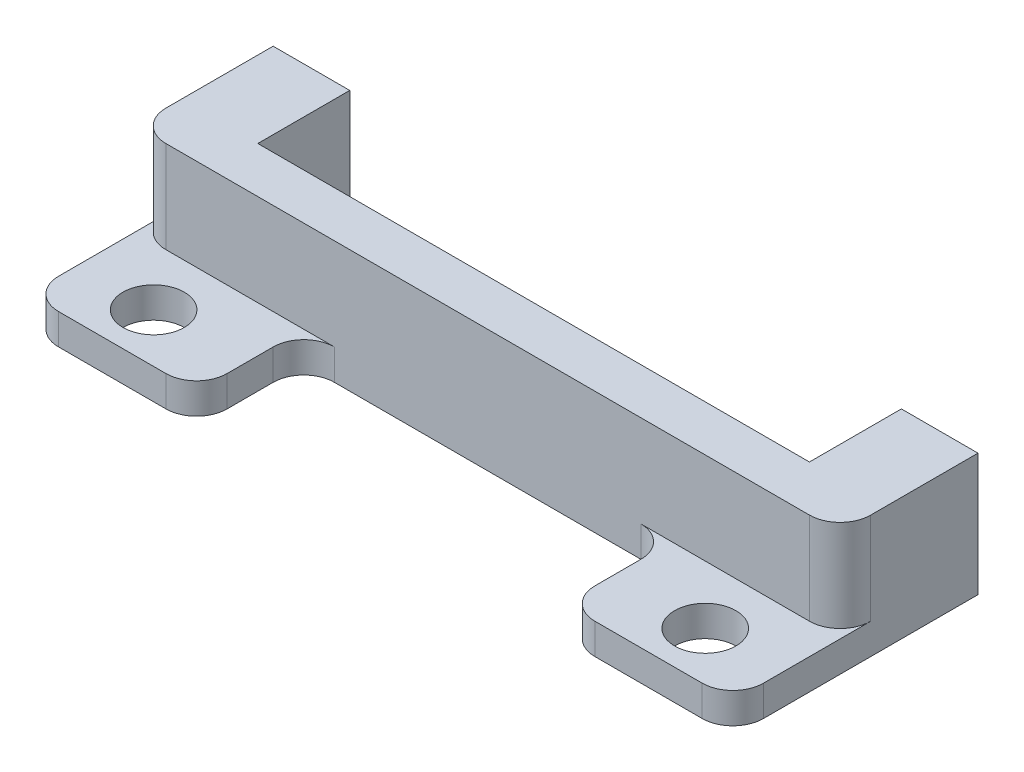
ISO-10303-21;
HEADER;
FILE_DESCRIPTION(('STEP AP214'),'2;1');
FILE_NAME('part.step','',(''),(''),'','','');
FILE_SCHEMA(('AUTOMOTIVE_DESIGN { 1 0 10303 214 1 1 1 1 }'));
ENDSEC;
DATA;
#1=APPLICATION_CONTEXT('core data for automotive mechanical design processes');
#2=APPLICATION_PROTOCOL_DEFINITION('international standard','automotive_design',2000,#1);
#3=PRODUCT_CONTEXT('',#1,'mechanical');
#4=PRODUCT('Part','Part','',(#3));
#5=PRODUCT_RELATED_PRODUCT_CATEGORY('part','',(#4));
#6=PRODUCT_DEFINITION_FORMATION('','',#4);
#7=PRODUCT_DEFINITION_CONTEXT('part definition',#1,'design');
#8=PRODUCT_DEFINITION('design','',#6,#7);
#9=PRODUCT_DEFINITION_SHAPE('','',#8);
#10=(LENGTH_UNIT() NAMED_UNIT(*) SI_UNIT(.MILLI.,.METRE.));
#11=(NAMED_UNIT(*) PLANE_ANGLE_UNIT() SI_UNIT($,.RADIAN.));
#12=(NAMED_UNIT(*) SI_UNIT($,.STERADIAN.) SOLID_ANGLE_UNIT());
#13=UNCERTAINTY_MEASURE_WITH_UNIT(LENGTH_MEASURE(1.E-05),#10,'distance_accuracy_value','');
#14=(GEOMETRIC_REPRESENTATION_CONTEXT(3) GLOBAL_UNCERTAINTY_ASSIGNED_CONTEXT((#13)) GLOBAL_UNIT_ASSIGNED_CONTEXT((#10,
#11,#12)) REPRESENTATION_CONTEXT('',''));
#15=CARTESIAN_POINT('',(0.,0.,0.));
#16=DIRECTION('',(0.,0.,1.));
#17=DIRECTION('',(1.,0.,0.));
#18=AXIS2_PLACEMENT_3D('',#15,#16,#17);
#19=CARTESIAN_POINT('',(0.,2.,0.));
#20=DIRECTION('',(0.,-1.,0.));
#21=DIRECTION('',(0.,0.,-1.));
#22=AXIS2_PLACEMENT_3D('',#19,#20,#21);
#23=PLANE('',#22);
#24=CARTESIAN_POINT('',(5.,2.,12.8));
#25=DIRECTION('',(0.,1.,0.));
#26=DIRECTION('',(0.,0.,1.));
#27=AXIS2_PLACEMENT_3D('',#24,#25,#26);
#28=CIRCLE('',#27,2.);
#29=CARTESIAN_POINT('',(5.,2.,14.8));
#30=VERTEX_POINT('',#29);
#31=EDGE_CURVE('E372',#30,#30,#28,.T.);
#32=ORIENTED_EDGE('',*,*,#31,.F.);
#33=EDGE_LOOP('',(#32));
#34=FACE_BOUND('',#33,.T.);
#35=DIRECTION('',(1.,0.,0.));
#36=VECTOR('',#35,1.);
#37=CARTESIAN_POINT('',(0.,2.,16.));
#38=LINE('',#37,#36);
#39=CARTESIAN_POINT('',(2.,2.,16.));
#40=VERTEX_POINT('',#39);
#41=CARTESIAN_POINT('',(9.,2.,16.));
#42=VERTEX_POINT('',#41);
#43=EDGE_CURVE('E238',#40,#42,#38,.T.);
#44=ORIENTED_EDGE('',*,*,#43,.T.);
#45=CARTESIAN_POINT('',(9.,2.,14.));
#46=DIRECTION('',(0.,-1.,0.));
#47=DIRECTION('',(0.,0.,-1.));
#48=AXIS2_PLACEMENT_3D('',#45,#46,#47);
#49=CIRCLE('',#48,2.);
#50=CARTESIAN_POINT('',(11.,2.,14.));
#51=VERTEX_POINT('',#50);
#52=EDGE_CURVE('E50',#42,#51,#49,.F.);
#53=ORIENTED_EDGE('',*,*,#52,.T.);
#54=DIRECTION('',(0.,0.,1.));
#55=VECTOR('',#54,1.);
#56=CARTESIAN_POINT('',(11.,2.,16.));
#57=LINE('',#56,#55);
#58=CARTESIAN_POINT('',(11.,2.,11.));
#59=VERTEX_POINT('',#58);
#60=EDGE_CURVE('E339',#59,#51,#57,.T.);
#61=ORIENTED_EDGE('',*,*,#60,.F.);
#62=CARTESIAN_POINT('',(13.,2.,11.));
#63=DIRECTION('',(0.,-1.,0.));
#64=DIRECTION('',(0.,0.,-1.));
#65=AXIS2_PLACEMENT_3D('',#62,#63,#64);
#66=CIRCLE('',#65,2.);
#67=CARTESIAN_POINT('',(13.,2.,9.));
#68=VERTEX_POINT('',#67);
#69=EDGE_CURVE('E43',#59,#68,#66,.T.);
#70=ORIENTED_EDGE('',*,*,#69,.T.);
#71=DIRECTION('',(1.,0.,0.));
#72=VECTOR('',#71,1.);
#73=CARTESIAN_POINT('',(0.,2.,9.));
#74=LINE('',#73,#72);
#75=CARTESIAN_POINT('',(2.,2.,9.));
#76=VERTEX_POINT('',#75);
#77=EDGE_CURVE('E229',#76,#68,#74,.T.);
#78=ORIENTED_EDGE('',*,*,#77,.F.);
#79=CARTESIAN_POINT('',(2.,2.,7.));
#80=DIRECTION('',(0.,-1.,0.));
#81=DIRECTION('',(0.,0.,-1.));
#82=AXIS2_PLACEMENT_3D('',#79,#80,#81);
#83=CIRCLE('',#82,2.);
#84=CARTESIAN_POINT('',(0.,2.,7.));
#85=VERTEX_POINT('',#84);
#86=EDGE_CURVE('E301',#76,#85,#83,.T.);
#87=ORIENTED_EDGE('',*,*,#86,.T.);
#88=DIRECTION('',(0.,0.,1.));
#89=VECTOR('',#88,1.);
#90=CARTESIAN_POINT('',(0.,2.,16.));
#91=LINE('',#90,#89);
#92=CARTESIAN_POINT('',(0.,2.,14.));
#93=VERTEX_POINT('',#92);
#94=EDGE_CURVE('E233',#85,#93,#91,.T.);
#95=ORIENTED_EDGE('',*,*,#94,.T.);
#96=CARTESIAN_POINT('',(2.,2.,14.));
#97=DIRECTION('',(0.,-1.,0.));
#98=DIRECTION('',(0.,0.,-1.));
#99=AXIS2_PLACEMENT_3D('',#96,#97,#98);
#100=CIRCLE('',#99,2.);
#101=EDGE_CURVE('E287',#93,#40,#100,.F.);
#102=ORIENTED_EDGE('',*,*,#101,.T.);
#103=EDGE_LOOP('',(#44,#53,#61,#70,#78,#87,#95,#102));
#104=FACE_BOUND('',#103,.T.);
#105=ADVANCED_FACE('F35',(#34,#104),#23,.F.);
#106=CARTESIAN_POINT('',(0.,2.,16.));
#107=DIRECTION('',(0.,0.,-1.));
#108=DIRECTION('',(-1.,0.,0.));
#109=AXIS2_PLACEMENT_3D('',#106,#107,#108);
#110=PLANE('',#109);
#111=DIRECTION('',(1.,0.,0.));
#112=VECTOR('',#111,1.);
#113=CARTESIAN_POINT('',(0.,0.,16.));
#114=LINE('',#113,#112);
#115=CARTESIAN_POINT('',(2.,0.,16.));
#116=VERTEX_POINT('',#115);
#117=CARTESIAN_POINT('',(9.,0.,16.));
#118=VERTEX_POINT('',#117);
#119=EDGE_CURVE('E246',#116,#118,#114,.T.);
#120=ORIENTED_EDGE('',*,*,#119,.T.);
#121=DIRECTION('',(0.,1.,0.));
#122=VECTOR('',#121,1.);
#123=CARTESIAN_POINT('',(9.,2.,16.));
#124=LINE('',#123,#122);
#125=EDGE_CURVE('E330',#118,#42,#124,.T.);
#126=ORIENTED_EDGE('',*,*,#125,.T.);
#127=ORIENTED_EDGE('',*,*,#43,.F.);
#128=DIRECTION('',(0.,-1.,0.));
#129=VECTOR('',#128,1.);
#130=CARTESIAN_POINT('',(2.,2.,16.));
#131=LINE('',#130,#129);
#132=EDGE_CURVE('E273',#40,#116,#131,.T.);
#133=ORIENTED_EDGE('',*,*,#132,.T.);
#134=EDGE_LOOP('',(#120,#126,#127,#133));
#135=FACE_BOUND('',#134,.T.);
#136=ADVANCED_FACE('F424',(#135),#110,.F.);
#137=CARTESIAN_POINT('',(41.,2.,12.8));
#138=DIRECTION('',(0.,1.,0.));
#139=DIRECTION('',(0.,0.,-1.));
#140=AXIS2_PLACEMENT_3D('',#137,#138,#139);
#141=CIRCLE('',#140,2.);
#142=CARTESIAN_POINT('',(41.,2.,10.8));
#143=VERTEX_POINT('',#142);
#144=EDGE_CURVE('E361',#143,#143,#141,.T.);
#145=ORIENTED_EDGE('',*,*,#144,.F.);
#146=EDGE_LOOP('',(#145));
#147=FACE_BOUND('',#146,.T.);
#148=DIRECTION('',(0.,0.,-1.));
#149=VECTOR('',#148,1.);
#150=CARTESIAN_POINT('',(35.,2.,16.));
#151=LINE('',#150,#149);
#152=CARTESIAN_POINT('',(35.,2.,14.));
#153=VERTEX_POINT('',#152);
#154=CARTESIAN_POINT('',(35.,2.,11.));
#155=VERTEX_POINT('',#154);
#156=EDGE_CURVE('E365',#153,#155,#151,.T.);
#157=ORIENTED_EDGE('',*,*,#156,.F.);
#158=CARTESIAN_POINT('',(37.,2.,14.));
#159=DIRECTION('',(0.,-1.,0.));
#160=DIRECTION('',(0.,0.,-1.));
#161=AXIS2_PLACEMENT_3D('',#158,#159,#160);
#162=CIRCLE('',#161,2.);
#163=CARTESIAN_POINT('',(37.,2.,16.));
#164=VERTEX_POINT('',#163);
#165=EDGE_CURVE('E317',#153,#164,#162,.F.);
#166=ORIENTED_EDGE('',*,*,#165,.T.);
#167=CARTESIAN_POINT('',(44.,2.,16.));
#168=VERTEX_POINT('',#167);
#169=EDGE_CURVE('E236',#164,#168,#38,.T.);
#170=ORIENTED_EDGE('',*,*,#169,.T.);
#171=CARTESIAN_POINT('',(44.,2.,14.));
#172=DIRECTION('',(0.,-1.,0.));
#173=DIRECTION('',(0.,0.,-1.));
#174=AXIS2_PLACEMENT_3D('',#171,#172,#173);
#175=CIRCLE('',#174,2.);
#176=CARTESIAN_POINT('',(46.,2.,14.));
#177=VERTEX_POINT('',#176);
#178=EDGE_CURVE('E285',#168,#177,#175,.F.);
#179=ORIENTED_EDGE('',*,*,#178,.T.);
#180=DIRECTION('',(0.,0.,-1.));
#181=VECTOR('',#180,1.);
#182=CARTESIAN_POINT('',(46.,2.,0.));
#183=LINE('',#182,#181);
#184=CARTESIAN_POINT('',(46.,2.,7.));
#185=VERTEX_POINT('',#184);
#186=EDGE_CURVE('E240',#177,#185,#183,.T.);
#187=ORIENTED_EDGE('',*,*,#186,.T.);
#188=CARTESIAN_POINT('',(44.,2.,7.));
#189=DIRECTION('',(0.,-1.,0.));
#190=DIRECTION('',(0.,0.,-1.));
#191=AXIS2_PLACEMENT_3D('',#188,#189,#190);
#192=CIRCLE('',#191,2.);
#193=CARTESIAN_POINT('',(44.,2.,9.));
#194=VERTEX_POINT('',#193);
#195=EDGE_CURVE('E304',#185,#194,#192,.T.);
#196=ORIENTED_EDGE('',*,*,#195,.T.);
#197=CARTESIAN_POINT('',(33.,2.,9.));
#198=VERTEX_POINT('',#197);
#199=EDGE_CURVE('E232',#198,#194,#74,.T.);
#200=ORIENTED_EDGE('',*,*,#199,.F.);
#201=CARTESIAN_POINT('',(33.,2.,11.));
#202=DIRECTION('',(0.,-1.,0.));
#203=DIRECTION('',(0.,0.,-1.));
#204=AXIS2_PLACEMENT_3D('',#201,#202,#203);
#205=CIRCLE('',#204,2.);
#206=EDGE_CURVE('E333',#198,#155,#205,.T.);
#207=ORIENTED_EDGE('',*,*,#206,.T.);
#208=EDGE_LOOP('',(#157,#166,#170,#179,#187,#196,#200,#207));
#209=FACE_BOUND('',#208,.T.);
#210=ADVANCED_FACE('F445',(#147,#209),#23,.F.);
#211=CARTESIAN_POINT('',(0.,2.,16.));
#212=DIRECTION('',(1.,0.,0.));
#213=DIRECTION('',(0.,0.,-1.));
#214=AXIS2_PLACEMENT_3D('',#211,#212,#213);
#215=PLANE('',#214);
#216=DIRECTION('',(0.,0.,1.));
#217=VECTOR('',#216,1.);
#218=CARTESIAN_POINT('',(0.,0.,16.));
#219=LINE('',#218,#217);
#220=CARTESIAN_POINT('',(0.,0.,0.));
#221=VERTEX_POINT('',#220);
#222=CARTESIAN_POINT('',(0.,0.,14.));
#223=VERTEX_POINT('',#222);
#224=EDGE_CURVE('E228',#221,#223,#219,.T.);
#225=ORIENTED_EDGE('',*,*,#224,.T.);
#226=DIRECTION('',(0.,-1.,0.));
#227=VECTOR('',#226,1.);
#228=CARTESIAN_POINT('',(0.,2.,14.));
#229=LINE('',#228,#227);
#230=EDGE_CURVE('E283',#223,#93,#229,.F.);
#231=ORIENTED_EDGE('',*,*,#230,.T.);
#232=ORIENTED_EDGE('',*,*,#94,.F.);
#233=DIRECTION('',(0.,-1.,0.));
#234=VECTOR('',#233,1.);
#235=CARTESIAN_POINT('',(0.,2.,7.));
#236=LINE('',#235,#234);
#237=CARTESIAN_POINT('',(0.,8.,7.));
#238=VERTEX_POINT('',#237);
#239=EDGE_CURVE('E281',#85,#238,#236,.F.);
#240=ORIENTED_EDGE('',*,*,#239,.T.);
#241=DIRECTION('',(0.,0.,1.));
#242=VECTOR('',#241,1.);
#243=CARTESIAN_POINT('',(0.,8.,0.));
#244=LINE('',#243,#242);
#245=CARTESIAN_POINT('',(0.,8.,0.));
#246=VERTEX_POINT('',#245);
#247=EDGE_CURVE('E231',#246,#238,#244,.T.);
#248=ORIENTED_EDGE('',*,*,#247,.F.);
#249=DIRECTION('',(0.,-1.,0.));
#250=VECTOR('',#249,1.);
#251=CARTESIAN_POINT('',(0.,2.,0.));
#252=LINE('',#251,#250);
#253=EDGE_CURVE('E242',#246,#221,#252,.T.);
#254=ORIENTED_EDGE('',*,*,#253,.T.);
#255=EDGE_LOOP('',(#225,#231,#232,#240,#248,#254));
#256=FACE_BOUND('',#255,.T.);
#257=ADVANCED_FACE('F412',(#256),#215,.F.);
#258=ORIENTED_EDGE('',*,*,#169,.F.);
#259=DIRECTION('',(0.,1.,0.));
#260=VECTOR('',#259,1.);
#261=CARTESIAN_POINT('',(37.,2.,16.));
#262=LINE('',#261,#260);
#263=CARTESIAN_POINT('',(37.,0.,16.));
#264=VERTEX_POINT('',#263);
#265=EDGE_CURVE('E319',#164,#264,#262,.F.);
#266=ORIENTED_EDGE('',*,*,#265,.T.);
#267=CARTESIAN_POINT('',(44.,0.,16.));
#268=VERTEX_POINT('',#267);
#269=EDGE_CURVE('E245',#264,#268,#114,.T.);
#270=ORIENTED_EDGE('',*,*,#269,.T.);
#271=DIRECTION('',(0.,-1.,0.));
#272=VECTOR('',#271,1.);
#273=CARTESIAN_POINT('',(44.,2.,16.));
#274=LINE('',#273,#272);
#275=EDGE_CURVE('E209',#268,#168,#274,.F.);
#276=ORIENTED_EDGE('',*,*,#275,.T.);
#277=EDGE_LOOP('',(#258,#266,#270,#276));
#278=FACE_BOUND('',#277,.T.);
#279=ADVANCED_FACE('F450',(#278),#110,.F.);
#280=CARTESIAN_POINT('',(46.,2.,0.));
#281=DIRECTION('',(-1.,0.,0.));
#282=DIRECTION('',(0.,0.,1.));
#283=AXIS2_PLACEMENT_3D('',#280,#281,#282);
#284=PLANE('',#283);
#285=ORIENTED_EDGE('',*,*,#186,.F.);
#286=DIRECTION('',(0.,-1.,0.));
#287=VECTOR('',#286,1.);
#288=CARTESIAN_POINT('',(46.,2.,14.));
#289=LINE('',#288,#287);
#290=CARTESIAN_POINT('',(46.,0.,14.));
#291=VERTEX_POINT('',#290);
#292=EDGE_CURVE('E299',#177,#291,#289,.T.);
#293=ORIENTED_EDGE('',*,*,#292,.T.);
#294=DIRECTION('',(0.,0.,-1.));
#295=VECTOR('',#294,1.);
#296=CARTESIAN_POINT('',(46.,0.,0.));
#297=LINE('',#296,#295);
#298=CARTESIAN_POINT('',(46.,0.,0.));
#299=VERTEX_POINT('',#298);
#300=EDGE_CURVE('E206',#291,#299,#297,.T.);
#301=ORIENTED_EDGE('',*,*,#300,.T.);
#302=DIRECTION('',(0.,-1.,0.));
#303=VECTOR('',#302,1.);
#304=CARTESIAN_POINT('',(46.,2.,0.));
#305=LINE('',#304,#303);
#306=CARTESIAN_POINT('',(46.,8.,0.));
#307=VERTEX_POINT('',#306);
#308=EDGE_CURVE('E201',#307,#299,#305,.T.);
#309=ORIENTED_EDGE('',*,*,#308,.F.);
#310=DIRECTION('',(0.,0.,-1.));
#311=VECTOR('',#310,1.);
#312=CARTESIAN_POINT('',(46.,8.,0.));
#313=LINE('',#312,#311);
#314=CARTESIAN_POINT('',(46.,8.,7.));
#315=VERTEX_POINT('',#314);
#316=EDGE_CURVE('E184',#315,#307,#313,.T.);
#317=ORIENTED_EDGE('',*,*,#316,.F.);
#318=DIRECTION('',(0.,-1.,0.));
#319=VECTOR('',#318,1.);
#320=CARTESIAN_POINT('',(46.,2.,7.));
#321=LINE('',#320,#319);
#322=EDGE_CURVE('E297',#315,#185,#321,.T.);
#323=ORIENTED_EDGE('',*,*,#322,.T.);
#324=EDGE_LOOP('',(#285,#293,#301,#309,#317,#323));
#325=FACE_BOUND('',#324,.T.);
#326=ADVANCED_FACE('F203',(#325),#284,.F.);
#327=CARTESIAN_POINT('',(41.,2.,0.));
#328=DIRECTION('',(0.,0.,1.));
#329=DIRECTION('',(1.,0.,0.));
#330=AXIS2_PLACEMENT_3D('',#327,#328,#329);
#331=PLANE('',#330);
#332=DIRECTION('',(-1.,0.,0.));
#333=VECTOR('',#332,1.);
#334=CARTESIAN_POINT('',(41.,0.,0.));
#335=LINE('',#334,#333);
#336=CARTESIAN_POINT('',(41.,0.,0.));
#337=VERTEX_POINT('',#336);
#338=EDGE_CURVE('E250',#299,#337,#335,.T.);
#339=ORIENTED_EDGE('',*,*,#338,.T.);
#340=DIRECTION('',(0.,-1.,0.));
#341=VECTOR('',#340,1.);
#342=CARTESIAN_POINT('',(41.,2.,0.));
#343=LINE('',#342,#341);
#344=CARTESIAN_POINT('',(41.,8.,0.));
#345=VERTEX_POINT('',#344);
#346=EDGE_CURVE('E210',#345,#337,#343,.T.);
#347=ORIENTED_EDGE('',*,*,#346,.F.);
#348=DIRECTION('',(-1.,0.,0.));
#349=VECTOR('',#348,1.);
#350=CARTESIAN_POINT('',(0.,8.,0.));
#351=LINE('',#350,#349);
#352=EDGE_CURVE('E190',#307,#345,#351,.T.);
#353=ORIENTED_EDGE('',*,*,#352,.F.);
#354=ORIENTED_EDGE('',*,*,#308,.T.);
#355=EDGE_LOOP('',(#339,#347,#353,#354));
#356=FACE_BOUND('',#355,.T.);
#357=ADVANCED_FACE('F212',(#356),#331,.F.);
#358=CARTESIAN_POINT('',(41.,2.,6.));
#359=DIRECTION('',(1.,0.,0.));
#360=DIRECTION('',(0.,0.,-1.));
#361=AXIS2_PLACEMENT_3D('',#358,#359,#360);
#362=PLANE('',#361);
#363=DIRECTION('',(0.,0.,1.));
#364=VECTOR('',#363,1.);
#365=CARTESIAN_POINT('',(41.,0.,6.));
#366=LINE('',#365,#364);
#367=CARTESIAN_POINT('',(41.,0.,6.));
#368=VERTEX_POINT('',#367);
#369=EDGE_CURVE('E252',#337,#368,#366,.T.);
#370=ORIENTED_EDGE('',*,*,#369,.T.);
#371=DIRECTION('',(0.,-1.,0.));
#372=VECTOR('',#371,1.);
#373=CARTESIAN_POINT('',(41.,2.,6.));
#374=LINE('',#373,#372);
#375=CARTESIAN_POINT('',(41.,8.,6.));
#376=VERTEX_POINT('',#375);
#377=EDGE_CURVE('E267',#376,#368,#374,.T.);
#378=ORIENTED_EDGE('',*,*,#377,.F.);
#379=DIRECTION('',(0.,0.,1.));
#380=VECTOR('',#379,1.);
#381=CARTESIAN_POINT('',(41.,8.,0.));
#382=LINE('',#381,#380);
#383=EDGE_CURVE('E214',#345,#376,#382,.T.);
#384=ORIENTED_EDGE('',*,*,#383,.F.);
#385=ORIENTED_EDGE('',*,*,#346,.T.);
#386=EDGE_LOOP('',(#370,#378,#384,#385));
#387=FACE_BOUND('',#386,.T.);
#388=ADVANCED_FACE('F397',(#387),#362,.F.);
#389=CARTESIAN_POINT('',(5.,2.,6.));
#390=DIRECTION('',(0.,0.,1.));
#391=DIRECTION('',(1.,0.,0.));
#392=AXIS2_PLACEMENT_3D('',#389,#390,#391);
#393=PLANE('',#392);
#394=DIRECTION('',(-1.,0.,0.));
#395=VECTOR('',#394,1.);
#396=CARTESIAN_POINT('',(5.,0.,6.));
#397=LINE('',#396,#395);
#398=CARTESIAN_POINT('',(5.,0.,6.));
#399=VERTEX_POINT('',#398);
#400=EDGE_CURVE('E254',#368,#399,#397,.T.);
#401=ORIENTED_EDGE('',*,*,#400,.T.);
#402=DIRECTION('',(0.,-1.,0.));
#403=VECTOR('',#402,1.);
#404=CARTESIAN_POINT('',(5.,2.,6.));
#405=LINE('',#404,#403);
#406=CARTESIAN_POINT('',(5.,8.,6.));
#407=VERTEX_POINT('',#406);
#408=EDGE_CURVE('E264',#407,#399,#405,.T.);
#409=ORIENTED_EDGE('',*,*,#408,.F.);
#410=DIRECTION('',(-1.,0.,0.));
#411=VECTOR('',#410,1.);
#412=CARTESIAN_POINT('',(0.,8.,6.));
#413=LINE('',#412,#411);
#414=EDGE_CURVE('E216',#376,#407,#413,.T.);
#415=ORIENTED_EDGE('',*,*,#414,.F.);
#416=ORIENTED_EDGE('',*,*,#377,.T.);
#417=EDGE_LOOP('',(#401,#409,#415,#416));
#418=FACE_BOUND('',#417,.T.);
#419=ADVANCED_FACE('F401',(#418),#393,.F.);
#420=CARTESIAN_POINT('',(5.,2.,0.));
#421=DIRECTION('',(-1.,0.,0.));
#422=DIRECTION('',(0.,0.,1.));
#423=AXIS2_PLACEMENT_3D('',#420,#421,#422);
#424=PLANE('',#423);
#425=DIRECTION('',(0.,0.,-1.));
#426=VECTOR('',#425,1.);
#427=CARTESIAN_POINT('',(5.,0.,0.));
#428=LINE('',#427,#426);
#429=CARTESIAN_POINT('',(5.,0.,0.));
#430=VERTEX_POINT('',#429);
#431=EDGE_CURVE('E256',#399,#430,#428,.T.);
#432=ORIENTED_EDGE('',*,*,#431,.T.);
#433=DIRECTION('',(0.,-1.,0.));
#434=VECTOR('',#433,1.);
#435=CARTESIAN_POINT('',(5.,2.,0.));
#436=LINE('',#435,#434);
#437=CARTESIAN_POINT('',(5.,8.,0.));
#438=VERTEX_POINT('',#437);
#439=EDGE_CURVE('E261',#438,#430,#436,.T.);
#440=ORIENTED_EDGE('',*,*,#439,.F.);
#441=DIRECTION('',(0.,0.,-1.));
#442=VECTOR('',#441,1.);
#443=CARTESIAN_POINT('',(5.,8.,0.));
#444=LINE('',#443,#442);
#445=EDGE_CURVE('E222',#407,#438,#444,.T.);
#446=ORIENTED_EDGE('',*,*,#445,.F.);
#447=ORIENTED_EDGE('',*,*,#408,.T.);
#448=EDGE_LOOP('',(#432,#440,#446,#447));
#449=FACE_BOUND('',#448,.T.);
#450=ADVANCED_FACE('F404',(#449),#424,.F.);
#451=CARTESIAN_POINT('',(0.,2.,0.));
#452=DIRECTION('',(0.,0.,1.));
#453=DIRECTION('',(1.,0.,0.));
#454=AXIS2_PLACEMENT_3D('',#451,#452,#453);
#455=PLANE('',#454);
#456=DIRECTION('',(-1.,0.,0.));
#457=VECTOR('',#456,1.);
#458=CARTESIAN_POINT('',(0.,0.,0.));
#459=LINE('',#458,#457);
#460=EDGE_CURVE('E237',#430,#221,#459,.T.);
#461=ORIENTED_EDGE('',*,*,#460,.T.);
#462=ORIENTED_EDGE('',*,*,#253,.F.);
#463=DIRECTION('',(-1.,0.,0.));
#464=VECTOR('',#463,1.);
#465=CARTESIAN_POINT('',(0.,8.,0.));
#466=LINE('',#465,#464);
#467=EDGE_CURVE('E225',#438,#246,#466,.T.);
#468=ORIENTED_EDGE('',*,*,#467,.F.);
#469=ORIENTED_EDGE('',*,*,#439,.T.);
#470=EDGE_LOOP('',(#461,#462,#468,#469));
#471=FACE_BOUND('',#470,.T.);
#472=ADVANCED_FACE('F408',(#471),#455,.F.);
#473=CARTESIAN_POINT('',(0.,0.,0.));
#474=DIRECTION('',(0.,-1.,0.));
#475=DIRECTION('',(0.,0.,-1.));
#476=AXIS2_PLACEMENT_3D('',#473,#474,#475);
#477=PLANE('',#476);
#478=ORIENTED_EDGE('',*,*,#269,.F.);
#479=CARTESIAN_POINT('',(37.,0.,14.));
#480=DIRECTION('',(0.,-1.,0.));
#481=DIRECTION('',(0.,0.,-1.));
#482=AXIS2_PLACEMENT_3D('',#479,#480,#481);
#483=CIRCLE('',#482,2.);
#484=CARTESIAN_POINT('',(35.,0.,14.));
#485=VERTEX_POINT('',#484);
#486=EDGE_CURVE('E323',#264,#485,#483,.T.);
#487=ORIENTED_EDGE('',*,*,#486,.T.);
#488=DIRECTION('',(0.,0.,-1.));
#489=VECTOR('',#488,1.);
#490=CARTESIAN_POINT('',(35.,0.,16.));
#491=LINE('',#490,#489);
#492=CARTESIAN_POINT('',(35.,0.,11.));
#493=VERTEX_POINT('',#492);
#494=EDGE_CURVE('E359',#485,#493,#491,.T.);
#495=ORIENTED_EDGE('',*,*,#494,.T.);
#496=CARTESIAN_POINT('',(33.,0.,11.));
#497=DIRECTION('',(0.,-1.,0.));
#498=DIRECTION('',(0.,0.,-1.));
#499=AXIS2_PLACEMENT_3D('',#496,#497,#498);
#500=CIRCLE('',#499,2.);
#501=CARTESIAN_POINT('',(33.,0.,9.00000000000001));
#502=VERTEX_POINT('',#501);
#503=EDGE_CURVE('E335',#493,#502,#500,.F.);
#504=ORIENTED_EDGE('',*,*,#503,.T.);
#505=DIRECTION('',(-1.,0.,0.));
#506=VECTOR('',#505,1.);
#507=CARTESIAN_POINT('',(11.,0.,9.));
#508=LINE('',#507,#506);
#509=CARTESIAN_POINT('',(13.,0.,9.));
#510=VERTEX_POINT('',#509);
#511=EDGE_CURVE('E348',#502,#510,#508,.T.);
#512=ORIENTED_EDGE('',*,*,#511,.T.);
#513=CARTESIAN_POINT('',(13.,0.,11.));
#514=DIRECTION('',(0.,-1.,0.));
#515=DIRECTION('',(0.,0.,-1.));
#516=AXIS2_PLACEMENT_3D('',#513,#514,#515);
#517=CIRCLE('',#516,2.);
#518=CARTESIAN_POINT('',(11.,0.,11.));
#519=VERTEX_POINT('',#518);
#520=EDGE_CURVE('E11',#510,#519,#517,.F.);
#521=ORIENTED_EDGE('',*,*,#520,.T.);
#522=DIRECTION('',(0.,0.,1.));
#523=VECTOR('',#522,1.);
#524=CARTESIAN_POINT('',(11.,0.,16.));
#525=LINE('',#524,#523);
#526=CARTESIAN_POINT('',(11.,0.,14.));
#527=VERTEX_POINT('',#526);
#528=EDGE_CURVE('E358',#519,#527,#525,.T.);
#529=ORIENTED_EDGE('',*,*,#528,.T.);
#530=CARTESIAN_POINT('',(9.,0.,14.));
#531=DIRECTION('',(0.,-1.,0.));
#532=DIRECTION('',(0.,0.,-1.));
#533=AXIS2_PLACEMENT_3D('',#530,#531,#532);
#534=CIRCLE('',#533,2.);
#535=EDGE_CURVE('E321',#527,#118,#534,.T.);
#536=ORIENTED_EDGE('',*,*,#535,.T.);
#537=ORIENTED_EDGE('',*,*,#119,.F.);
#538=CARTESIAN_POINT('',(2.,0.,14.));
#539=DIRECTION('',(0.,-1.,0.));
#540=DIRECTION('',(0.,0.,-1.));
#541=AXIS2_PLACEMENT_3D('',#538,#539,#540);
#542=CIRCLE('',#541,2.);
#543=EDGE_CURVE('E279',#116,#223,#542,.T.);
#544=ORIENTED_EDGE('',*,*,#543,.T.);
#545=ORIENTED_EDGE('',*,*,#224,.F.);
#546=ORIENTED_EDGE('',*,*,#460,.F.);
#547=ORIENTED_EDGE('',*,*,#431,.F.);
#548=ORIENTED_EDGE('',*,*,#400,.F.);
#549=ORIENTED_EDGE('',*,*,#369,.F.);
#550=ORIENTED_EDGE('',*,*,#338,.F.);
#551=ORIENTED_EDGE('',*,*,#300,.F.);
#552=CARTESIAN_POINT('',(44.,0.,14.));
#553=DIRECTION('',(0.,-1.,0.));
#554=DIRECTION('',(0.,0.,-1.));
#555=AXIS2_PLACEMENT_3D('',#552,#553,#554);
#556=CIRCLE('',#555,2.);
#557=EDGE_CURVE('E276',#291,#268,#556,.T.);
#558=ORIENTED_EDGE('',*,*,#557,.T.);
#559=EDGE_LOOP('',(#478,#487,#495,#504,#512,#521,#529,#536,#537,#544,#545,#546,#547,#548,#549,
#550,#551,#558));
#560=FACE_BOUND('',#559,.T.);
#561=CARTESIAN_POINT('',(5.,0.,12.8));
#562=DIRECTION('',(0.,1.,0.));
#563=DIRECTION('',(0.,0.,1.));
#564=AXIS2_PLACEMENT_3D('',#561,#562,#563);
#565=CIRCLE('',#564,2.);
#566=CARTESIAN_POINT('',(5.,0.,14.8));
#567=VERTEX_POINT('',#566);
#568=EDGE_CURVE('E369',#567,#567,#565,.T.);
#569=ORIENTED_EDGE('',*,*,#568,.T.);
#570=EDGE_LOOP('',(#569));
#571=FACE_BOUND('',#570,.T.);
#572=CARTESIAN_POINT('',(41.,0.,12.8));
#573=DIRECTION('',(0.,1.,0.));
#574=DIRECTION('',(0.,0.,-1.));
#575=AXIS2_PLACEMENT_3D('',#572,#573,#574);
#576=CIRCLE('',#575,2.);
#577=CARTESIAN_POINT('',(41.,0.,10.8));
#578=VERTEX_POINT('',#577);
#579=EDGE_CURVE('E375',#578,#578,#576,.T.);
#580=ORIENTED_EDGE('',*,*,#579,.T.);
#581=EDGE_LOOP('',(#580));
#582=FACE_BOUND('',#581,.T.);
#583=ADVANCED_FACE('F352',(#560,#571,#582),#477,.T.);
#584=CARTESIAN_POINT('',(0.,8.,9.));
#585=DIRECTION('',(0.,0.,-1.));
#586=DIRECTION('',(-1.,0.,0.));
#587=AXIS2_PLACEMENT_3D('',#584,#585,#586);
#588=PLANE('',#587);
#589=ORIENTED_EDGE('',*,*,#511,.F.);
#590=DIRECTION('',(0.,1.,0.));
#591=VECTOR('',#590,1.);
#592=CARTESIAN_POINT('',(33.,2.,9.));
#593=LINE('',#592,#591);
#594=EDGE_CURVE('E309',#502,#198,#593,.T.);
#595=ORIENTED_EDGE('',*,*,#594,.T.);
#596=ORIENTED_EDGE('',*,*,#199,.T.);
#597=DIRECTION('',(0.,-1.,0.));
#598=VECTOR('',#597,1.);
#599=CARTESIAN_POINT('',(44.,8.,9.));
#600=LINE('',#599,#598);
#601=CARTESIAN_POINT('',(44.,8.,9.));
#602=VERTEX_POINT('',#601);
#603=EDGE_CURVE('E289',#194,#602,#600,.F.);
#604=ORIENTED_EDGE('',*,*,#603,.T.);
#605=DIRECTION('',(1.,0.,0.));
#606=VECTOR('',#605,1.);
#607=CARTESIAN_POINT('',(0.,8.,9.));
#608=LINE('',#607,#606);
#609=CARTESIAN_POINT('',(2.,8.,9.));
#610=VERTEX_POINT('',#609);
#611=EDGE_CURVE('E198',#610,#602,#608,.T.);
#612=ORIENTED_EDGE('',*,*,#611,.F.);
#613=DIRECTION('',(0.,-1.,0.));
#614=VECTOR('',#613,1.);
#615=CARTESIAN_POINT('',(2.,8.,9.));
#616=LINE('',#615,#614);
#617=EDGE_CURVE('E291',#610,#76,#616,.T.);
#618=ORIENTED_EDGE('',*,*,#617,.T.);
#619=ORIENTED_EDGE('',*,*,#77,.T.);
#620=DIRECTION('',(0.,1.,0.));
#621=VECTOR('',#620,1.);
#622=CARTESIAN_POINT('',(13.,0.,9.));
#623=LINE('',#622,#621);
#624=EDGE_CURVE('E307',#68,#510,#623,.F.);
#625=ORIENTED_EDGE('',*,*,#624,.T.);
#626=EDGE_LOOP('',(#589,#595,#596,#604,#612,#618,#619,#625));
#627=FACE_BOUND('',#626,.T.);
#628=ADVANCED_FACE('F347',(#627),#588,.F.);
#629=CARTESIAN_POINT('',(0.,8.,0.));
#630=DIRECTION('',(0.,1.,0.));
#631=DIRECTION('',(0.,0.,1.));
#632=AXIS2_PLACEMENT_3D('',#629,#630,#631);
#633=PLANE('',#632);
#634=ORIENTED_EDGE('',*,*,#247,.T.);
#635=CARTESIAN_POINT('',(2.,8.,7.));
#636=DIRECTION('',(0.,1.,0.));
#637=DIRECTION('',(0.,0.,1.));
#638=AXIS2_PLACEMENT_3D('',#635,#636,#637);
#639=CIRCLE('',#638,2.);
#640=EDGE_CURVE('E295',#238,#610,#639,.T.);
#641=ORIENTED_EDGE('',*,*,#640,.T.);
#642=ORIENTED_EDGE('',*,*,#611,.T.);
#643=CARTESIAN_POINT('',(44.,8.,7.));
#644=DIRECTION('',(0.,1.,0.));
#645=DIRECTION('',(0.,0.,1.));
#646=AXIS2_PLACEMENT_3D('',#643,#644,#645);
#647=CIRCLE('',#646,2.);
#648=EDGE_CURVE('E194',#602,#315,#647,.T.);
#649=ORIENTED_EDGE('',*,*,#648,.T.);
#650=ORIENTED_EDGE('',*,*,#316,.T.);
#651=ORIENTED_EDGE('',*,*,#352,.T.);
#652=ORIENTED_EDGE('',*,*,#383,.T.);
#653=ORIENTED_EDGE('',*,*,#414,.T.);
#654=ORIENTED_EDGE('',*,*,#445,.T.);
#655=ORIENTED_EDGE('',*,*,#467,.T.);
#656=EDGE_LOOP('',(#634,#641,#642,#649,#650,#651,#652,#653,#654,#655));
#657=FACE_BOUND('',#656,.T.);
#658=ADVANCED_FACE('F187',(#657),#633,.T.);
#659=CARTESIAN_POINT('',(2.,2.,14.));
#660=DIRECTION('',(0.,-1.,0.));
#661=DIRECTION('',(0.,0.,-1.));
#662=AXIS2_PLACEMENT_3D('',#659,#660,#661);
#663=CYLINDRICAL_SURFACE('',#662,2.);
#664=ORIENTED_EDGE('',*,*,#101,.F.);
#665=ORIENTED_EDGE('',*,*,#230,.F.);
#666=ORIENTED_EDGE('',*,*,#543,.F.);
#667=ORIENTED_EDGE('',*,*,#132,.F.);
#668=EDGE_LOOP('',(#664,#665,#666,#667));
#669=FACE_BOUND('',#668,.T.);
#670=ADVANCED_FACE('F421',(#669),#663,.T.);
#671=CARTESIAN_POINT('',(2.,8.,7.));
#672=DIRECTION('',(0.,-1.,0.));
#673=DIRECTION('',(0.,0.,-1.));
#674=AXIS2_PLACEMENT_3D('',#671,#672,#673);
#675=CYLINDRICAL_SURFACE('',#674,2.);
#676=ORIENTED_EDGE('',*,*,#640,.F.);
#677=ORIENTED_EDGE('',*,*,#239,.F.);
#678=ORIENTED_EDGE('',*,*,#86,.F.);
#679=ORIENTED_EDGE('',*,*,#617,.F.);
#680=EDGE_LOOP('',(#676,#677,#678,#679));
#681=FACE_BOUND('',#680,.T.);
#682=ADVANCED_FACE('F416',(#681),#675,.T.);
#683=CARTESIAN_POINT('',(44.,2.,14.));
#684=DIRECTION('',(0.,-1.,0.));
#685=DIRECTION('',(0.,0.,-1.));
#686=AXIS2_PLACEMENT_3D('',#683,#684,#685);
#687=CYLINDRICAL_SURFACE('',#686,2.);
#688=ORIENTED_EDGE('',*,*,#178,.F.);
#689=ORIENTED_EDGE('',*,*,#275,.F.);
#690=ORIENTED_EDGE('',*,*,#557,.F.);
#691=ORIENTED_EDGE('',*,*,#292,.F.);
#692=EDGE_LOOP('',(#688,#689,#690,#691));
#693=FACE_BOUND('',#692,.T.);
#694=ADVANCED_FACE('F391',(#693),#687,.T.);
#695=CARTESIAN_POINT('',(44.,2.,7.));
#696=DIRECTION('',(0.,-1.,0.));
#697=DIRECTION('',(0.,0.,-1.));
#698=AXIS2_PLACEMENT_3D('',#695,#696,#697);
#699=CYLINDRICAL_SURFACE('',#698,2.);
#700=ORIENTED_EDGE('',*,*,#648,.F.);
#701=ORIENTED_EDGE('',*,*,#603,.F.);
#702=ORIENTED_EDGE('',*,*,#195,.F.);
#703=ORIENTED_EDGE('',*,*,#322,.F.);
#704=EDGE_LOOP('',(#700,#701,#702,#703));
#705=FACE_BOUND('',#704,.T.);
#706=ADVANCED_FACE('F385',(#705),#699,.T.);
#707=CARTESIAN_POINT('',(41.,0.,12.8));
#708=DIRECTION('',(0.,1.,0.));
#709=DIRECTION('',(0.,0.,1.));
#710=AXIS2_PLACEMENT_3D('',#707,#708,#709);
#711=CYLINDRICAL_SURFACE('',#710,2.);
#712=ORIENTED_EDGE('',*,*,#579,.F.);
#713=EDGE_LOOP('',(#712));
#714=FACE_BOUND('',#713,.T.);
#715=ORIENTED_EDGE('',*,*,#144,.T.);
#716=EDGE_LOOP('',(#715));
#717=FACE_BOUND('',#716,.T.);
#718=ADVANCED_FACE('F439',(#714,#717),#711,.F.);
#719=CARTESIAN_POINT('',(5.,0.,12.8));
#720=DIRECTION('',(0.,1.,0.));
#721=DIRECTION('',(0.,0.,1.));
#722=AXIS2_PLACEMENT_3D('',#719,#720,#721);
#723=CYLINDRICAL_SURFACE('',#722,2.);
#724=ORIENTED_EDGE('',*,*,#568,.F.);
#725=EDGE_LOOP('',(#724));
#726=FACE_BOUND('',#725,.T.);
#727=ORIENTED_EDGE('',*,*,#31,.T.);
#728=EDGE_LOOP('',(#727));
#729=FACE_BOUND('',#728,.T.);
#730=ADVANCED_FACE('F430',(#726,#729),#723,.F.);
#731=CARTESIAN_POINT('',(11.,0.,16.));
#732=DIRECTION('',(-1.,0.,0.));
#733=DIRECTION('',(0.,0.,1.));
#734=AXIS2_PLACEMENT_3D('',#731,#732,#733);
#735=PLANE('',#734);
#736=ORIENTED_EDGE('',*,*,#528,.F.);
#737=DIRECTION('',(0.,1.,0.));
#738=VECTOR('',#737,1.);
#739=CARTESIAN_POINT('',(11.,2.,11.));
#740=LINE('',#739,#738);
#741=EDGE_CURVE('E327',#519,#59,#740,.T.);
#742=ORIENTED_EDGE('',*,*,#741,.T.);
#743=ORIENTED_EDGE('',*,*,#60,.T.);
#744=DIRECTION('',(0.,1.,0.));
#745=VECTOR('',#744,1.);
#746=CARTESIAN_POINT('',(11.,0.,14.));
#747=LINE('',#746,#745);
#748=EDGE_CURVE('E325',#51,#527,#747,.F.);
#749=ORIENTED_EDGE('',*,*,#748,.T.);
#750=EDGE_LOOP('',(#736,#742,#743,#749));
#751=FACE_BOUND('',#750,.T.);
#752=ADVANCED_FACE('F427',(#751),#735,.F.);
#753=CARTESIAN_POINT('',(35.,0.,16.));
#754=DIRECTION('',(1.,0.,0.));
#755=DIRECTION('',(0.,0.,-1.));
#756=AXIS2_PLACEMENT_3D('',#753,#754,#755);
#757=PLANE('',#756);
#758=ORIENTED_EDGE('',*,*,#156,.T.);
#759=DIRECTION('',(0.,1.,0.));
#760=VECTOR('',#759,1.);
#761=CARTESIAN_POINT('',(35.,0.,11.));
#762=LINE('',#761,#760);
#763=EDGE_CURVE('E315',#155,#493,#762,.F.);
#764=ORIENTED_EDGE('',*,*,#763,.T.);
#765=ORIENTED_EDGE('',*,*,#494,.F.);
#766=DIRECTION('',(0.,1.,0.));
#767=VECTOR('',#766,1.);
#768=CARTESIAN_POINT('',(35.,0.,14.));
#769=LINE('',#768,#767);
#770=EDGE_CURVE('E312',#485,#153,#769,.T.);
#771=ORIENTED_EDGE('',*,*,#770,.T.);
#772=EDGE_LOOP('',(#758,#764,#765,#771));
#773=FACE_BOUND('',#772,.T.);
#774=ADVANCED_FACE('F429',(#773),#757,.F.);
#775=CARTESIAN_POINT('',(33.,8.,11.));
#776=DIRECTION('',(0.,-1.,0.));
#777=DIRECTION('',(0.,0.,-1.));
#778=AXIS2_PLACEMENT_3D('',#775,#776,#777);
#779=CYLINDRICAL_SURFACE('',#778,2.);
#780=ORIENTED_EDGE('',*,*,#503,.F.);
#781=ORIENTED_EDGE('',*,*,#763,.F.);
#782=ORIENTED_EDGE('',*,*,#206,.F.);
#783=ORIENTED_EDGE('',*,*,#594,.F.);
#784=EDGE_LOOP('',(#780,#781,#782,#783));
#785=FACE_BOUND('',#784,.T.);
#786=ADVANCED_FACE('F436',(#785),#779,.F.);
#787=CARTESIAN_POINT('',(37.,0.,14.));
#788=DIRECTION('',(0.,1.,0.));
#789=DIRECTION('',(0.,0.,1.));
#790=AXIS2_PLACEMENT_3D('',#787,#788,#789);
#791=CYLINDRICAL_SURFACE('',#790,2.);
#792=ORIENTED_EDGE('',*,*,#486,.F.);
#793=ORIENTED_EDGE('',*,*,#265,.F.);
#794=ORIENTED_EDGE('',*,*,#165,.F.);
#795=ORIENTED_EDGE('',*,*,#770,.F.);
#796=EDGE_LOOP('',(#792,#793,#794,#795));
#797=FACE_BOUND('',#796,.T.);
#798=ADVANCED_FACE('F469',(#797),#791,.T.);
#799=CARTESIAN_POINT('',(13.,0.,11.));
#800=DIRECTION('',(0.,-1.,0.));
#801=DIRECTION('',(0.,0.,-1.));
#802=AXIS2_PLACEMENT_3D('',#799,#800,#801);
#803=CYLINDRICAL_SURFACE('',#802,2.);
#804=ORIENTED_EDGE('',*,*,#520,.F.);
#805=ORIENTED_EDGE('',*,*,#624,.F.);
#806=ORIENTED_EDGE('',*,*,#69,.F.);
#807=ORIENTED_EDGE('',*,*,#741,.F.);
#808=EDGE_LOOP('',(#804,#805,#806,#807));
#809=FACE_BOUND('',#808,.T.);
#810=ADVANCED_FACE('F343',(#809),#803,.F.);
#811=CARTESIAN_POINT('',(9.,2.,14.));
#812=DIRECTION('',(0.,1.,0.));
#813=DIRECTION('',(0.,0.,1.));
#814=AXIS2_PLACEMENT_3D('',#811,#812,#813);
#815=CYLINDRICAL_SURFACE('',#814,2.);
#816=ORIENTED_EDGE('',*,*,#535,.F.);
#817=ORIENTED_EDGE('',*,*,#748,.F.);
#818=ORIENTED_EDGE('',*,*,#52,.F.);
#819=ORIENTED_EDGE('',*,*,#125,.F.);
#820=EDGE_LOOP('',(#816,#817,#818,#819));
#821=FACE_BOUND('',#820,.T.);
#822=ADVANCED_FACE('F37',(#821),#815,.T.);
#823=CLOSED_SHELL('',(#105,#136,#210,#257,#279,#326,#357,#388,#419,#450,#472,#583,#628,#658,
#670,#682,#694,#706,#718,#730,#752,#774,#786,#798,#810,#822));
#824=MANIFOLD_SOLID_BREP('B2',#823);
#825=ADVANCED_BREP_SHAPE_REPRESENTATION('',(#18,#824),#14);
#826=SHAPE_DEFINITION_REPRESENTATION(#9,#825);
ENDSEC;
END-ISO-10303-21;
